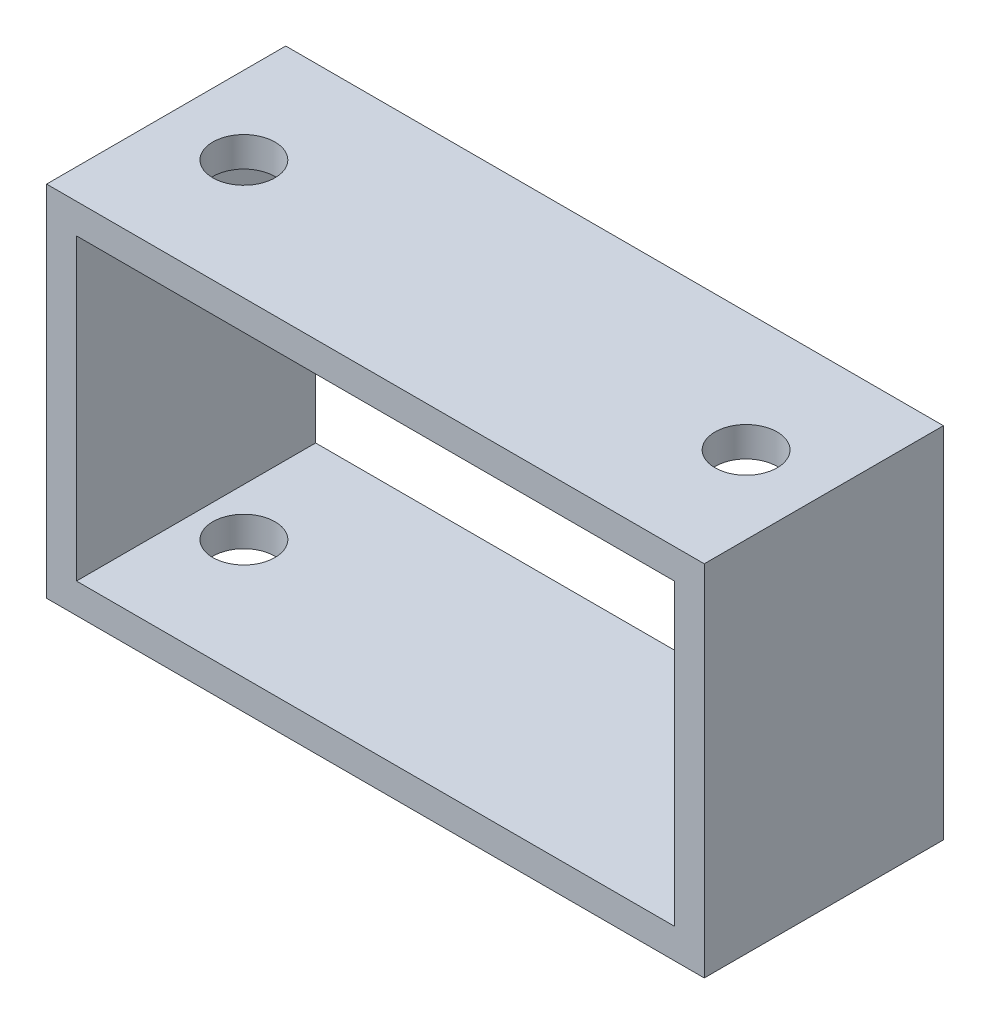
ISO-10303-21;
HEADER;
FILE_DESCRIPTION(('STEP AP214'),'2;1');
FILE_NAME('part.step','',(''),(''),'','','');
FILE_SCHEMA(('AUTOMOTIVE_DESIGN { 1 0 10303 214 1 1 1 1 }'));
ENDSEC;
DATA;
#1=APPLICATION_CONTEXT('core data for automotive mechanical design processes');
#2=APPLICATION_PROTOCOL_DEFINITION('international standard','automotive_design',2000,#1);
#3=PRODUCT_CONTEXT('',#1,'mechanical');
#4=PRODUCT('Part','Part','',(#3));
#5=PRODUCT_RELATED_PRODUCT_CATEGORY('part','',(#4));
#6=PRODUCT_DEFINITION_FORMATION('','',#4);
#7=PRODUCT_DEFINITION_CONTEXT('part definition',#1,'design');
#8=PRODUCT_DEFINITION('design','',#6,#7);
#9=PRODUCT_DEFINITION_SHAPE('','',#8);
#10=(LENGTH_UNIT() NAMED_UNIT(*) SI_UNIT(.MILLI.,.METRE.));
#11=(NAMED_UNIT(*) PLANE_ANGLE_UNIT() SI_UNIT($,.RADIAN.));
#12=(NAMED_UNIT(*) SI_UNIT($,.STERADIAN.) SOLID_ANGLE_UNIT());
#13=UNCERTAINTY_MEASURE_WITH_UNIT(LENGTH_MEASURE(1.E-05),#10,'distance_accuracy_value','');
#14=(GEOMETRIC_REPRESENTATION_CONTEXT(3) GLOBAL_UNCERTAINTY_ASSIGNED_CONTEXT((#13)) GLOBAL_UNIT_ASSIGNED_CONTEXT((#10,
#11,#12)) REPRESENTATION_CONTEXT('',''));
#15=CARTESIAN_POINT('',(0.,0.,0.));
#16=DIRECTION('',(0.,0.,1.));
#17=DIRECTION('',(1.,0.,0.));
#18=AXIS2_PLACEMENT_3D('',#15,#16,#17);
#19=CARTESIAN_POINT('',(27.5,30.,10.));
#20=DIRECTION('',(-1.,0.,0.));
#21=DIRECTION('',(0.,0.,1.));
#22=AXIS2_PLACEMENT_3D('',#19,#20,#21);
#23=PLANE('',#22);
#24=DIRECTION('',(0.,0.,-1.));
#25=VECTOR('',#24,1.);
#26=CARTESIAN_POINT('',(27.5,0.,10.));
#27=LINE('',#26,#25);
#28=CARTESIAN_POINT('',(27.5,0.,10.));
#29=VERTEX_POINT('',#28);
#30=CARTESIAN_POINT('',(27.5,0.,-10.));
#31=VERTEX_POINT('',#30);
#32=EDGE_CURVE('E121',#29,#31,#27,.T.);
#33=ORIENTED_EDGE('',*,*,#32,.T.);
#34=DIRECTION('',(0.,-1.,0.));
#35=VECTOR('',#34,1.);
#36=CARTESIAN_POINT('',(27.5,30.,-10.));
#37=LINE('',#36,#35);
#38=CARTESIAN_POINT('',(27.5,30.,-10.));
#39=VERTEX_POINT('',#38);
#40=EDGE_CURVE('E11',#39,#31,#37,.T.);
#41=ORIENTED_EDGE('',*,*,#40,.F.);
#42=DIRECTION('',(0.,0.,-1.));
#43=VECTOR('',#42,1.);
#44=CARTESIAN_POINT('',(27.5,30.,10.));
#45=LINE('',#44,#43);
#46=CARTESIAN_POINT('',(27.5,30.,10.));
#47=VERTEX_POINT('',#46);
#48=EDGE_CURVE('E144',#47,#39,#45,.T.);
#49=ORIENTED_EDGE('',*,*,#48,.F.);
#50=DIRECTION('',(0.,-1.,0.));
#51=VECTOR('',#50,1.);
#52=CARTESIAN_POINT('',(27.5,30.,10.));
#53=LINE('',#52,#51);
#54=EDGE_CURVE('E154',#47,#29,#53,.T.);
#55=ORIENTED_EDGE('',*,*,#54,.T.);
#56=EDGE_LOOP('',(#33,#41,#49,#55));
#57=FACE_BOUND('',#56,.T.);
#58=ADVANCED_FACE('F41',(#57),#23,.F.);
#59=CARTESIAN_POINT('',(-27.5,30.,-10.));
#60=DIRECTION('',(0.,0.,1.));
#61=DIRECTION('',(1.,0.,0.));
#62=AXIS2_PLACEMENT_3D('',#59,#60,#61);
#63=PLANE('',#62);
#64=DIRECTION('',(-1.,0.,0.));
#65=VECTOR('',#64,1.);
#66=CARTESIAN_POINT('',(-25.,2.5,-10.));
#67=LINE('',#66,#65);
#68=CARTESIAN_POINT('',(25.,2.5,-10.));
#69=VERTEX_POINT('',#68);
#70=CARTESIAN_POINT('',(-25.,2.5,-10.));
#71=VERTEX_POINT('',#70);
#72=EDGE_CURVE('E127',#69,#71,#67,.T.);
#73=ORIENTED_EDGE('',*,*,#72,.F.);
#74=DIRECTION('',(0.,-1.,0.));
#75=VECTOR('',#74,1.);
#76=CARTESIAN_POINT('',(25.,2.5,-10.));
#77=LINE('',#76,#75);
#78=CARTESIAN_POINT('',(25.,27.5,-10.));
#79=VERTEX_POINT('',#78);
#80=EDGE_CURVE('E109',#79,#69,#77,.T.);
#81=ORIENTED_EDGE('',*,*,#80,.F.);
#82=DIRECTION('',(1.,0.,0.));
#83=VECTOR('',#82,1.);
#84=CARTESIAN_POINT('',(-25.,27.5,-10.));
#85=LINE('',#84,#83);
#86=CARTESIAN_POINT('',(-25.,27.5,-10.));
#87=VERTEX_POINT('',#86);
#88=EDGE_CURVE('E118',#87,#79,#85,.T.);
#89=ORIENTED_EDGE('',*,*,#88,.F.);
#90=DIRECTION('',(0.,1.,0.));
#91=VECTOR('',#90,1.);
#92=CARTESIAN_POINT('',(-25.,2.5,-10.));
#93=LINE('',#92,#91);
#94=EDGE_CURVE('E57',#71,#87,#93,.T.);
#95=ORIENTED_EDGE('',*,*,#94,.F.);
#96=EDGE_LOOP('',(#73,#81,#89,#95));
#97=FACE_BOUND('',#96,.T.);
#98=DIRECTION('',(-1.,0.,0.));
#99=VECTOR('',#98,1.);
#100=CARTESIAN_POINT('',(-27.5,0.,-10.));
#101=LINE('',#100,#99);
#102=CARTESIAN_POINT('',(-27.5,0.,-10.));
#103=VERTEX_POINT('',#102);
#104=EDGE_CURVE('E157',#31,#103,#101,.T.);
#105=ORIENTED_EDGE('',*,*,#104,.T.);
#106=DIRECTION('',(0.,-1.,0.));
#107=VECTOR('',#106,1.);
#108=CARTESIAN_POINT('',(-27.5,30.,-10.));
#109=LINE('',#108,#107);
#110=CARTESIAN_POINT('',(-27.5,30.,-10.));
#111=VERTEX_POINT('',#110);
#112=EDGE_CURVE('E49',#111,#103,#109,.T.);
#113=ORIENTED_EDGE('',*,*,#112,.F.);
#114=DIRECTION('',(-1.,0.,0.));
#115=VECTOR('',#114,1.);
#116=CARTESIAN_POINT('',(-27.5,30.,-10.));
#117=LINE('',#116,#115);
#118=EDGE_CURVE('E147',#39,#111,#117,.T.);
#119=ORIENTED_EDGE('',*,*,#118,.F.);
#120=ORIENTED_EDGE('',*,*,#40,.T.);
#121=EDGE_LOOP('',(#105,#113,#119,#120));
#122=FACE_BOUND('',#121,.T.);
#123=ADVANCED_FACE('F124',(#97,#122),#63,.F.);
#124=CARTESIAN_POINT('',(-27.5,30.,10.));
#125=DIRECTION('',(1.,0.,0.));
#126=DIRECTION('',(0.,0.,-1.));
#127=AXIS2_PLACEMENT_3D('',#124,#125,#126);
#128=PLANE('',#127);
#129=DIRECTION('',(0.,0.,1.));
#130=VECTOR('',#129,1.);
#131=CARTESIAN_POINT('',(-27.5,0.,10.));
#132=LINE('',#131,#130);
#133=CARTESIAN_POINT('',(-27.5,0.,10.));
#134=VERTEX_POINT('',#133);
#135=EDGE_CURVE('E159',#103,#134,#132,.T.);
#136=ORIENTED_EDGE('',*,*,#135,.T.);
#137=DIRECTION('',(0.,-1.,0.));
#138=VECTOR('',#137,1.);
#139=CARTESIAN_POINT('',(-27.5,30.,10.));
#140=LINE('',#139,#138);
#141=CARTESIAN_POINT('',(-27.5,30.,10.));
#142=VERTEX_POINT('',#141);
#143=EDGE_CURVE('E164',#142,#134,#140,.T.);
#144=ORIENTED_EDGE('',*,*,#143,.F.);
#145=DIRECTION('',(0.,0.,1.));
#146=VECTOR('',#145,1.);
#147=CARTESIAN_POINT('',(-27.5,30.,10.));
#148=LINE('',#147,#146);
#149=EDGE_CURVE('E150',#111,#142,#148,.T.);
#150=ORIENTED_EDGE('',*,*,#149,.F.);
#151=ORIENTED_EDGE('',*,*,#112,.T.);
#152=EDGE_LOOP('',(#136,#144,#150,#151));
#153=FACE_BOUND('',#152,.T.);
#154=ADVANCED_FACE('F219',(#153),#128,.F.);
#155=CARTESIAN_POINT('',(-27.5,30.,10.));
#156=DIRECTION('',(0.,0.,-1.));
#157=DIRECTION('',(-1.,0.,0.));
#158=AXIS2_PLACEMENT_3D('',#155,#156,#157);
#159=PLANE('',#158);
#160=DIRECTION('',(-1.,0.,0.));
#161=VECTOR('',#160,1.);
#162=CARTESIAN_POINT('',(-25.,27.5,10.));
#163=LINE('',#162,#161);
#164=CARTESIAN_POINT('',(25.,27.5,10.));
#165=VERTEX_POINT('',#164);
#166=CARTESIAN_POINT('',(-25.,27.5,10.));
#167=VERTEX_POINT('',#166);
#168=EDGE_CURVE('E129',#165,#167,#163,.T.);
#169=ORIENTED_EDGE('',*,*,#168,.F.);
#170=DIRECTION('',(0.,1.,0.));
#171=VECTOR('',#170,1.);
#172=CARTESIAN_POINT('',(25.,2.5,10.));
#173=LINE('',#172,#171);
#174=CARTESIAN_POINT('',(25.,2.5,10.));
#175=VERTEX_POINT('',#174);
#176=EDGE_CURVE('E65',#175,#165,#173,.T.);
#177=ORIENTED_EDGE('',*,*,#176,.F.);
#178=DIRECTION('',(1.,0.,0.));
#179=VECTOR('',#178,1.);
#180=CARTESIAN_POINT('',(-25.,2.5,10.));
#181=LINE('',#180,#179);
#182=CARTESIAN_POINT('',(-25.,2.5,10.));
#183=VERTEX_POINT('',#182);
#184=EDGE_CURVE('E115',#183,#175,#181,.T.);
#185=ORIENTED_EDGE('',*,*,#184,.F.);
#186=DIRECTION('',(0.,-1.,0.));
#187=VECTOR('',#186,1.);
#188=CARTESIAN_POINT('',(-25.,2.5,10.));
#189=LINE('',#188,#187);
#190=EDGE_CURVE('E135',#167,#183,#189,.T.);
#191=ORIENTED_EDGE('',*,*,#190,.F.);
#192=EDGE_LOOP('',(#169,#177,#185,#191));
#193=FACE_BOUND('',#192,.T.);
#194=DIRECTION('',(1.,0.,0.));
#195=VECTOR('',#194,1.);
#196=CARTESIAN_POINT('',(-27.5,0.,10.));
#197=LINE('',#196,#195);
#198=EDGE_CURVE('E148',#134,#29,#197,.T.);
#199=ORIENTED_EDGE('',*,*,#198,.T.);
#200=ORIENTED_EDGE('',*,*,#54,.F.);
#201=DIRECTION('',(1.,0.,0.));
#202=VECTOR('',#201,1.);
#203=CARTESIAN_POINT('',(-27.5,30.,10.));
#204=LINE('',#203,#202);
#205=EDGE_CURVE('E152',#142,#47,#204,.T.);
#206=ORIENTED_EDGE('',*,*,#205,.F.);
#207=ORIENTED_EDGE('',*,*,#143,.T.);
#208=EDGE_LOOP('',(#199,#200,#206,#207));
#209=FACE_BOUND('',#208,.T.);
#210=ADVANCED_FACE('F235',(#193,#209),#159,.F.);
#211=CARTESIAN_POINT('',(0.,30.,0.));
#212=DIRECTION('',(0.,-1.,0.));
#213=DIRECTION('',(0.,0.,-1.));
#214=AXIS2_PLACEMENT_3D('',#211,#212,#213);
#215=PLANE('',#214);
#216=CARTESIAN_POINT('',(-21.,30.,0.));
#217=DIRECTION('',(0.,1.,0.));
#218=DIRECTION('',(0.,0.,1.));
#219=AXIS2_PLACEMENT_3D('',#216,#217,#218);
#220=CIRCLE('',#219,2.6);
#221=CARTESIAN_POINT('',(-21.,30.,2.6));
#222=VERTEX_POINT('',#221);
#223=EDGE_CURVE('E177',#222,#222,#220,.T.);
#224=ORIENTED_EDGE('',*,*,#223,.F.);
#225=EDGE_LOOP('',(#224));
#226=FACE_BOUND('',#225,.T.);
#227=CARTESIAN_POINT('',(21.,30.,0.));
#228=DIRECTION('',(0.,1.,0.));
#229=DIRECTION('',(0.,0.,1.));
#230=AXIS2_PLACEMENT_3D('',#227,#228,#229);
#231=CIRCLE('',#230,2.6);
#232=CARTESIAN_POINT('',(21.,30.,2.6));
#233=VERTEX_POINT('',#232);
#234=EDGE_CURVE('E182',#233,#233,#231,.T.);
#235=ORIENTED_EDGE('',*,*,#234,.F.);
#236=EDGE_LOOP('',(#235));
#237=FACE_BOUND('',#236,.T.);
#238=ORIENTED_EDGE('',*,*,#48,.T.);
#239=ORIENTED_EDGE('',*,*,#118,.T.);
#240=ORIENTED_EDGE('',*,*,#149,.T.);
#241=ORIENTED_EDGE('',*,*,#205,.T.);
#242=EDGE_LOOP('',(#238,#239,#240,#241));
#243=FACE_BOUND('',#242,.T.);
#244=ADVANCED_FACE('F231',(#226,#237,#243),#215,.F.);
#245=CARTESIAN_POINT('',(0.,0.,0.));
#246=DIRECTION('',(0.,-1.,0.));
#247=DIRECTION('',(0.,0.,-1.));
#248=AXIS2_PLACEMENT_3D('',#245,#246,#247);
#249=PLANE('',#248);
#250=CARTESIAN_POINT('',(-21.,0.,0.));
#251=DIRECTION('',(0.,-1.,0.));
#252=DIRECTION('',(0.,0.,-1.));
#253=AXIS2_PLACEMENT_3D('',#250,#251,#252);
#254=CIRCLE('',#253,2.6);
#255=CARTESIAN_POINT('',(-21.,0.,-2.6));
#256=VERTEX_POINT('',#255);
#257=EDGE_CURVE('E171',#256,#256,#254,.F.);
#258=ORIENTED_EDGE('',*,*,#257,.T.);
#259=EDGE_LOOP('',(#258));
#260=FACE_BOUND('',#259,.T.);
#261=CARTESIAN_POINT('',(21.,0.,0.));
#262=DIRECTION('',(0.,-1.,0.));
#263=DIRECTION('',(0.,0.,-1.));
#264=AXIS2_PLACEMENT_3D('',#261,#262,#263);
#265=CIRCLE('',#264,2.6);
#266=CARTESIAN_POINT('',(21.,0.,-2.6));
#267=VERTEX_POINT('',#266);
#268=EDGE_CURVE('E185',#267,#267,#265,.F.);
#269=ORIENTED_EDGE('',*,*,#268,.T.);
#270=EDGE_LOOP('',(#269));
#271=FACE_BOUND('',#270,.T.);
#272=ORIENTED_EDGE('',*,*,#32,.F.);
#273=ORIENTED_EDGE('',*,*,#198,.F.);
#274=ORIENTED_EDGE('',*,*,#135,.F.);
#275=ORIENTED_EDGE('',*,*,#104,.F.);
#276=EDGE_LOOP('',(#272,#273,#274,#275));
#277=FACE_BOUND('',#276,.T.);
#278=ADVANCED_FACE('F226',(#260,#271,#277),#249,.T.);
#279=CARTESIAN_POINT('',(25.,2.5,-10.001));
#280=DIRECTION('',(1.,0.,0.));
#281=DIRECTION('',(0.,0.,-1.));
#282=AXIS2_PLACEMENT_3D('',#279,#280,#281);
#283=PLANE('',#282);
#284=ORIENTED_EDGE('',*,*,#80,.T.);
#285=DIRECTION('',(0.,0.,1.));
#286=VECTOR('',#285,1.);
#287=CARTESIAN_POINT('',(25.,2.5,-10.001));
#288=LINE('',#287,#286);
#289=EDGE_CURVE('E122',#69,#175,#288,.T.);
#290=ORIENTED_EDGE('',*,*,#289,.T.);
#291=ORIENTED_EDGE('',*,*,#176,.T.);
#292=DIRECTION('',(0.,0.,1.));
#293=VECTOR('',#292,1.);
#294=CARTESIAN_POINT('',(25.,27.5,-10.001));
#295=LINE('',#294,#293);
#296=EDGE_CURVE('E105',#79,#165,#295,.T.);
#297=ORIENTED_EDGE('',*,*,#296,.F.);
#298=EDGE_LOOP('',(#284,#290,#291,#297));
#299=FACE_BOUND('',#298,.T.);
#300=ADVANCED_FACE('F107',(#299),#283,.F.);
#301=CARTESIAN_POINT('',(-25.,2.5,-10.001));
#302=DIRECTION('',(0.,-1.,0.));
#303=DIRECTION('',(0.,0.,-1.));
#304=AXIS2_PLACEMENT_3D('',#301,#302,#303);
#305=PLANE('',#304);
#306=CARTESIAN_POINT('',(-21.,2.5,0.));
#307=DIRECTION('',(0.,-1.,0.));
#308=DIRECTION('',(0.,0.,-1.));
#309=AXIS2_PLACEMENT_3D('',#306,#307,#308);
#310=CIRCLE('',#309,2.6);
#311=CARTESIAN_POINT('',(-21.,2.5,-2.6));
#312=VERTEX_POINT('',#311);
#313=EDGE_CURVE('E190',#312,#312,#310,.T.);
#314=ORIENTED_EDGE('',*,*,#313,.T.);
#315=EDGE_LOOP('',(#314));
#316=FACE_BOUND('',#315,.T.);
#317=CARTESIAN_POINT('',(21.,2.5,0.));
#318=DIRECTION('',(0.,-1.,0.));
#319=DIRECTION('',(0.,0.,-1.));
#320=AXIS2_PLACEMENT_3D('',#317,#318,#319);
#321=CIRCLE('',#320,2.6);
#322=CARTESIAN_POINT('',(21.,2.5,-2.6));
#323=VERTEX_POINT('',#322);
#324=EDGE_CURVE('E170',#323,#323,#321,.T.);
#325=ORIENTED_EDGE('',*,*,#324,.T.);
#326=EDGE_LOOP('',(#325));
#327=FACE_BOUND('',#326,.T.);
#328=ORIENTED_EDGE('',*,*,#72,.T.);
#329=DIRECTION('',(0.,0.,1.));
#330=VECTOR('',#329,1.);
#331=CARTESIAN_POINT('',(-25.,2.5,-10.001));
#332=LINE('',#331,#330);
#333=EDGE_CURVE('E141',#71,#183,#332,.T.);
#334=ORIENTED_EDGE('',*,*,#333,.T.);
#335=ORIENTED_EDGE('',*,*,#184,.T.);
#336=ORIENTED_EDGE('',*,*,#289,.F.);
#337=EDGE_LOOP('',(#328,#334,#335,#336));
#338=FACE_BOUND('',#337,.T.);
#339=ADVANCED_FACE('F252',(#316,#327,#338),#305,.F.);
#340=CARTESIAN_POINT('',(-25.,2.5,-10.001));
#341=DIRECTION('',(-1.,0.,0.));
#342=DIRECTION('',(0.,0.,1.));
#343=AXIS2_PLACEMENT_3D('',#340,#341,#342);
#344=PLANE('',#343);
#345=ORIENTED_EDGE('',*,*,#94,.T.);
#346=DIRECTION('',(0.,0.,1.));
#347=VECTOR('',#346,1.);
#348=CARTESIAN_POINT('',(-25.,27.5,-10.001));
#349=LINE('',#348,#347);
#350=EDGE_CURVE('E114',#87,#167,#349,.T.);
#351=ORIENTED_EDGE('',*,*,#350,.T.);
#352=ORIENTED_EDGE('',*,*,#190,.T.);
#353=ORIENTED_EDGE('',*,*,#333,.F.);
#354=EDGE_LOOP('',(#345,#351,#352,#353));
#355=FACE_BOUND('',#354,.T.);
#356=ADVANCED_FACE('F255',(#355),#344,.F.);
#357=CARTESIAN_POINT('',(-25.,27.5,-10.001));
#358=DIRECTION('',(0.,1.,0.));
#359=DIRECTION('',(0.,0.,1.));
#360=AXIS2_PLACEMENT_3D('',#357,#358,#359);
#361=PLANE('',#360);
#362=CARTESIAN_POINT('',(-21.,27.5,0.));
#363=DIRECTION('',(0.,1.,0.));
#364=DIRECTION('',(0.,0.,1.));
#365=AXIS2_PLACEMENT_3D('',#362,#363,#364);
#366=CIRCLE('',#365,2.6);
#367=CARTESIAN_POINT('',(-21.,27.5,2.6));
#368=VERTEX_POINT('',#367);
#369=EDGE_CURVE('E44',#368,#368,#366,.T.);
#370=ORIENTED_EDGE('',*,*,#369,.T.);
#371=EDGE_LOOP('',(#370));
#372=FACE_BOUND('',#371,.T.);
#373=CARTESIAN_POINT('',(21.,27.5,0.));
#374=DIRECTION('',(0.,1.,0.));
#375=DIRECTION('',(0.,0.,1.));
#376=AXIS2_PLACEMENT_3D('',#373,#374,#375);
#377=CIRCLE('',#376,2.6);
#378=CARTESIAN_POINT('',(21.,27.5,2.6));
#379=VERTEX_POINT('',#378);
#380=EDGE_CURVE('E168',#379,#379,#377,.T.);
#381=ORIENTED_EDGE('',*,*,#380,.T.);
#382=EDGE_LOOP('',(#381));
#383=FACE_BOUND('',#382,.T.);
#384=ORIENTED_EDGE('',*,*,#88,.T.);
#385=ORIENTED_EDGE('',*,*,#296,.T.);
#386=ORIENTED_EDGE('',*,*,#168,.T.);
#387=ORIENTED_EDGE('',*,*,#350,.F.);
#388=EDGE_LOOP('',(#384,#385,#386,#387));
#389=FACE_BOUND('',#388,.T.);
#390=ADVANCED_FACE('F119',(#372,#383,#389),#361,.F.);
#391=CARTESIAN_POINT('',(21.,-7.35391052434009,0.));
#392=DIRECTION('',(0.,1.,0.));
#393=DIRECTION('',(0.,0.,1.));
#394=AXIS2_PLACEMENT_3D('',#391,#392,#393);
#395=CYLINDRICAL_SURFACE('',#394,2.6);
#396=ORIENTED_EDGE('',*,*,#234,.T.);
#397=EDGE_LOOP('',(#396));
#398=FACE_BOUND('',#397,.T.);
#399=ORIENTED_EDGE('',*,*,#380,.F.);
#400=EDGE_LOOP('',(#399));
#401=FACE_BOUND('',#400,.T.);
#402=ADVANCED_FACE('F201',(#398,#401),#395,.F.);
#403=CARTESIAN_POINT('',(-21.,-7.35391052434009,0.));
#404=DIRECTION('',(0.,1.,0.));
#405=DIRECTION('',(0.,0.,1.));
#406=AXIS2_PLACEMENT_3D('',#403,#404,#405);
#407=CYLINDRICAL_SURFACE('',#406,2.6);
#408=ORIENTED_EDGE('',*,*,#223,.T.);
#409=EDGE_LOOP('',(#408));
#410=FACE_BOUND('',#409,.T.);
#411=ORIENTED_EDGE('',*,*,#369,.F.);
#412=EDGE_LOOP('',(#411));
#413=FACE_BOUND('',#412,.T.);
#414=ADVANCED_FACE('F198',(#410,#413),#407,.F.);
#415=ORIENTED_EDGE('',*,*,#268,.F.);
#416=EDGE_LOOP('',(#415));
#417=FACE_BOUND('',#416,.T.);
#418=ORIENTED_EDGE('',*,*,#324,.F.);
#419=EDGE_LOOP('',(#418));
#420=FACE_BOUND('',#419,.T.);
#421=ADVANCED_FACE('F200',(#417,#420),#395,.F.);
#422=ORIENTED_EDGE('',*,*,#257,.F.);
#423=EDGE_LOOP('',(#422));
#424=FACE_BOUND('',#423,.T.);
#425=ORIENTED_EDGE('',*,*,#313,.F.);
#426=EDGE_LOOP('',(#425));
#427=FACE_BOUND('',#426,.T.);
#428=ADVANCED_FACE('F204',(#424,#427),#407,.F.);
#429=CLOSED_SHELL('',(#58,#123,#154,#210,#244,#278,#300,#339,#356,#390,#402,#414,#421,#428));
#430=MANIFOLD_SOLID_BREP('B2',#429);
#431=ADVANCED_BREP_SHAPE_REPRESENTATION('',(#18,#430),#14);
#432=SHAPE_DEFINITION_REPRESENTATION(#9,#431);
ENDSEC;
END-ISO-10303-21;
